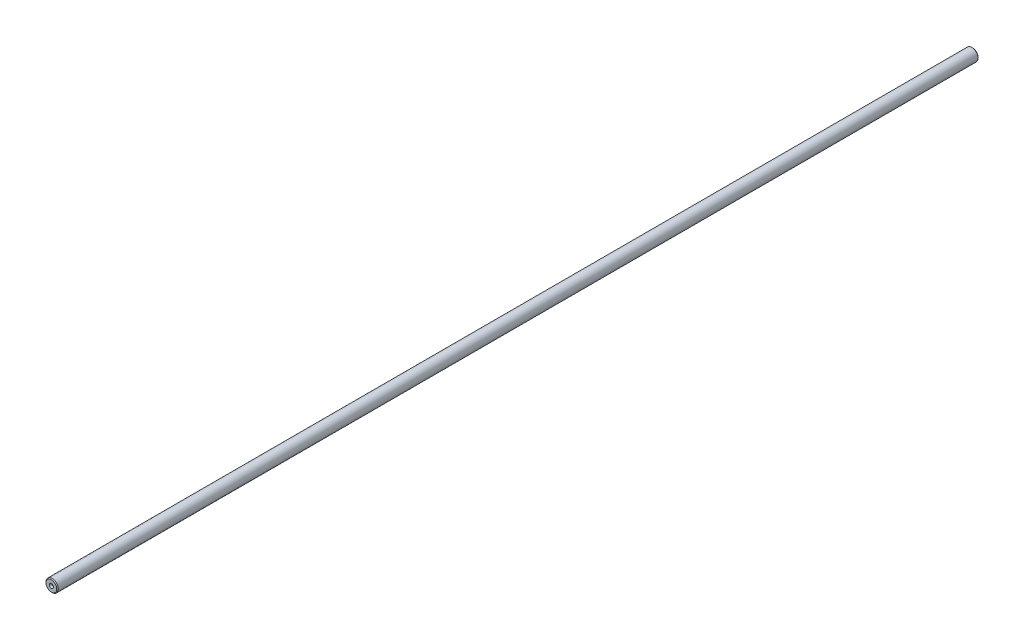
ISO-10303-21;
HEADER;
FILE_DESCRIPTION(('STEP AP214'),'2;1');
FILE_NAME('part.step','',(''),(''),'','','');
FILE_SCHEMA(('AUTOMOTIVE_DESIGN { 1 0 10303 214 1 1 1 1 }'));
ENDSEC;
DATA;
#1=APPLICATION_CONTEXT('core data for automotive mechanical design processes');
#2=APPLICATION_PROTOCOL_DEFINITION('international standard','automotive_design',2000,#1);
#3=PRODUCT_CONTEXT('',#1,'mechanical');
#4=PRODUCT('Part','Part','',(#3));
#5=PRODUCT_RELATED_PRODUCT_CATEGORY('part','',(#4));
#6=PRODUCT_DEFINITION_FORMATION('','',#4);
#7=PRODUCT_DEFINITION_CONTEXT('part definition',#1,'design');
#8=PRODUCT_DEFINITION('design','',#6,#7);
#9=PRODUCT_DEFINITION_SHAPE('','',#8);
#10=(LENGTH_UNIT() NAMED_UNIT(*) SI_UNIT(.MILLI.,.METRE.));
#11=(NAMED_UNIT(*) PLANE_ANGLE_UNIT() SI_UNIT($,.RADIAN.));
#12=(NAMED_UNIT(*) SI_UNIT($,.STERADIAN.) SOLID_ANGLE_UNIT());
#13=UNCERTAINTY_MEASURE_WITH_UNIT(LENGTH_MEASURE(1.E-05),#10,'distance_accuracy_value','');
#14=(GEOMETRIC_REPRESENTATION_CONTEXT(3) GLOBAL_UNCERTAINTY_ASSIGNED_CONTEXT((#13)) GLOBAL_UNIT_ASSIGNED_CONTEXT((#10,
#11,#12)) REPRESENTATION_CONTEXT('',''));
#15=CARTESIAN_POINT('',(0.,0.,0.));
#16=DIRECTION('',(0.,0.,1.));
#17=DIRECTION('',(1.,0.,0.));
#18=AXIS2_PLACEMENT_3D('',#15,#16,#17);
#19=CARTESIAN_POINT('',(0.,0.,600.));
#20=DIRECTION('',(0.,0.,-1.));
#21=DIRECTION('',(-1.,0.,0.));
#22=AXIS2_PLACEMENT_3D('',#19,#20,#21);
#23=CYLINDRICAL_SURFACE('',#22,8.);
#24=CARTESIAN_POINT('',(0.,0.,599.));
#25=DIRECTION('',(0.,0.,1.));
#26=DIRECTION('',(1.,0.,0.));
#27=AXIS2_PLACEMENT_3D('',#24,#25,#26);
#28=CIRCLE('',#27,8.);
#29=CARTESIAN_POINT('',(8.,0.,599.));
#30=VERTEX_POINT('',#29);
#31=EDGE_CURVE('E54',#30,#30,#28,.F.);
#32=ORIENTED_EDGE('',*,*,#31,.T.);
#33=EDGE_LOOP('',(#32));
#34=FACE_BOUND('',#33,.T.);
#35=CARTESIAN_POINT('',(0.,0.,-599.));
#36=DIRECTION('',(0.,0.,1.));
#37=DIRECTION('',(1.,0.,0.));
#38=AXIS2_PLACEMENT_3D('',#35,#36,#37);
#39=CIRCLE('',#38,8.);
#40=CARTESIAN_POINT('',(8.,0.,-599.));
#41=VERTEX_POINT('',#40);
#42=EDGE_CURVE('E95',#41,#41,#39,.T.);
#43=ORIENTED_EDGE('',*,*,#42,.T.);
#44=EDGE_LOOP('',(#43));
#45=FACE_BOUND('',#44,.T.);
#46=ADVANCED_FACE('F44',(#34,#45),#23,.T.);
#47=CARTESIAN_POINT('',(0.,0.,600.));
#48=DIRECTION('',(0.,0.,1.));
#49=DIRECTION('',(1.,0.,0.));
#50=AXIS2_PLACEMENT_3D('',#47,#48,#49);
#51=PLANE('',#50);
#52=CARTESIAN_POINT('',(0.,0.,600.));
#53=DIRECTION('',(0.,0.,1.));
#54=DIRECTION('',(1.,0.,0.));
#55=AXIS2_PLACEMENT_3D('',#52,#53,#54);
#56=CIRCLE('',#55,7.00000000000023);
#57=CARTESIAN_POINT('',(7.00000000000023,0.,600.));
#58=VERTEX_POINT('',#57);
#59=EDGE_CURVE('E91',#58,#58,#56,.T.);
#60=ORIENTED_EDGE('',*,*,#59,.T.);
#61=EDGE_LOOP('',(#60));
#62=FACE_BOUND('',#61,.T.);
#63=CARTESIAN_POINT('',(0.,0.,600.));
#64=DIRECTION('',(0.,0.,1.));
#65=DIRECTION('',(1.,0.,0.));
#66=AXIS2_PLACEMENT_3D('',#63,#64,#65);
#67=CIRCLE('',#66,2.75);
#68=CARTESIAN_POINT('',(2.75,0.,600.));
#69=VERTEX_POINT('',#68);
#70=EDGE_CURVE('E80',#69,#69,#67,.T.);
#71=ORIENTED_EDGE('',*,*,#70,.F.);
#72=EDGE_LOOP('',(#71));
#73=FACE_BOUND('',#72,.T.);
#74=ADVANCED_FACE('F110',(#62,#73),#51,.T.);
#75=CARTESIAN_POINT('',(0.,0.,-600.));
#76=DIRECTION('',(0.,0.,1.));
#77=DIRECTION('',(1.,0.,0.));
#78=AXIS2_PLACEMENT_3D('',#75,#76,#77);
#79=PLANE('',#78);
#80=CARTESIAN_POINT('',(0.,0.,-600.));
#81=DIRECTION('',(0.,0.,1.));
#82=DIRECTION('',(1.,0.,0.));
#83=AXIS2_PLACEMENT_3D('',#80,#81,#82);
#84=CIRCLE('',#83,7.00000000000012);
#85=CARTESIAN_POINT('',(7.00000000000012,0.,-600.));
#86=VERTEX_POINT('',#85);
#87=EDGE_CURVE('E11',#86,#86,#84,.F.);
#88=ORIENTED_EDGE('',*,*,#87,.T.);
#89=EDGE_LOOP('',(#88));
#90=FACE_BOUND('',#89,.T.);
#91=CARTESIAN_POINT('',(0.,0.,-600.));
#92=DIRECTION('',(0.,0.,-1.));
#93=DIRECTION('',(-1.,0.,0.));
#94=AXIS2_PLACEMENT_3D('',#91,#92,#93);
#95=CIRCLE('',#94,2.75);
#96=CARTESIAN_POINT('',(-2.75,0.,-600.));
#97=VERTEX_POINT('',#96);
#98=EDGE_CURVE('E71',#97,#97,#95,.T.);
#99=ORIENTED_EDGE('',*,*,#98,.F.);
#100=EDGE_LOOP('',(#99));
#101=FACE_BOUND('',#100,.T.);
#102=ADVANCED_FACE('F113',(#90,#101),#79,.F.);
#103=CARTESIAN_POINT('',(0.,0.,-595.87124789759));
#104=DIRECTION('',(0.,0.,-1.));
#105=DIRECTION('',(-1.,0.,0.));
#106=AXIS2_PLACEMENT_3D('',#103,#104,#105);
#107=CONICAL_SURFACE('',#106,1.45,1.02974425867665);
#108=CARTESIAN_POINT('',(0.,0.,-595.));
#109=VERTEX_POINT('',#108);
#110=VERTEX_LOOP('',#109);
#111=FACE_BOUND('',#110,.T.);
#112=CARTESIAN_POINT('',(0.,0.,-595.87124789759));
#113=DIRECTION('',(0.,0.,-1.));
#114=DIRECTION('',(-1.,0.,0.));
#115=AXIS2_PLACEMENT_3D('',#112,#113,#114);
#116=CIRCLE('',#115,1.45);
#117=CARTESIAN_POINT('',(-1.45,0.,-595.87124789759));
#118=VERTEX_POINT('',#117);
#119=EDGE_CURVE('E87',#118,#118,#116,.T.);
#120=ORIENTED_EDGE('',*,*,#119,.T.);
#121=EDGE_LOOP('',(#120));
#122=FACE_BOUND('',#121,.T.);
#123=ADVANCED_FACE('F138',(#111,#122),#107,.F.);
#124=CARTESIAN_POINT('',(0.,0.,-600.));
#125=DIRECTION('',(0.,0.,-1.));
#126=DIRECTION('',(-1.,0.,0.));
#127=AXIS2_PLACEMENT_3D('',#124,#125,#126);
#128=CYLINDRICAL_SURFACE('',#127,1.45);
#129=ORIENTED_EDGE('',*,*,#119,.F.);
#130=EDGE_LOOP('',(#129));
#131=FACE_BOUND('',#130,.T.);
#132=CARTESIAN_POINT('',(0.,0.,-597.74833395016));
#133=DIRECTION('',(0.,0.,-1.));
#134=DIRECTION('',(-1.,0.,0.));
#135=AXIS2_PLACEMENT_3D('',#132,#133,#134);
#136=CIRCLE('',#135,1.45);
#137=CARTESIAN_POINT('',(-1.45,0.,-597.74833395016));
#138=VERTEX_POINT('',#137);
#139=EDGE_CURVE('E77',#138,#138,#136,.T.);
#140=ORIENTED_EDGE('',*,*,#139,.T.);
#141=EDGE_LOOP('',(#140));
#142=FACE_BOUND('',#141,.T.);
#143=ADVANCED_FACE('F143',(#131,#142),#128,.F.);
#144=CARTESIAN_POINT('',(0.,0.,-600.));
#145=DIRECTION('',(0.,0.,-1.));
#146=DIRECTION('',(-1.,0.,0.));
#147=AXIS2_PLACEMENT_3D('',#144,#145,#146);
#148=CONICAL_SURFACE('',#147,2.75,0.523598775598306);
#149=ORIENTED_EDGE('',*,*,#139,.F.);
#150=EDGE_LOOP('',(#149));
#151=FACE_BOUND('',#150,.T.);
#152=ORIENTED_EDGE('',*,*,#98,.T.);
#153=EDGE_LOOP('',(#152));
#154=FACE_BOUND('',#153,.T.);
#155=ADVANCED_FACE('F64',(#151,#154),#148,.F.);
#156=CARTESIAN_POINT('',(0.,0.,595.87124789759));
#157=DIRECTION('',(0.,0.,1.));
#158=DIRECTION('',(1.,0.,0.));
#159=AXIS2_PLACEMENT_3D('',#156,#157,#158);
#160=CONICAL_SURFACE('',#159,1.45,1.02974425867665);
#161=CARTESIAN_POINT('',(0.,0.,595.));
#162=VERTEX_POINT('',#161);
#163=VERTEX_LOOP('',#162);
#164=FACE_BOUND('',#163,.T.);
#165=CARTESIAN_POINT('',(0.,0.,595.87124789759));
#166=DIRECTION('',(0.,0.,1.));
#167=DIRECTION('',(1.,0.,0.));
#168=AXIS2_PLACEMENT_3D('',#165,#166,#167);
#169=CIRCLE('',#168,1.45);
#170=CARTESIAN_POINT('',(1.45,0.,595.87124789759));
#171=VERTEX_POINT('',#170);
#172=EDGE_CURVE('E68',#171,#171,#169,.T.);
#173=ORIENTED_EDGE('',*,*,#172,.T.);
#174=EDGE_LOOP('',(#173));
#175=FACE_BOUND('',#174,.T.);
#176=ADVANCED_FACE('F60',(#164,#175),#160,.F.);
#177=CARTESIAN_POINT('',(0.,0.,600.));
#178=DIRECTION('',(0.,0.,1.));
#179=DIRECTION('',(1.,0.,0.));
#180=AXIS2_PLACEMENT_3D('',#177,#178,#179);
#181=CYLINDRICAL_SURFACE('',#180,1.45);
#182=ORIENTED_EDGE('',*,*,#172,.F.);
#183=EDGE_LOOP('',(#182));
#184=FACE_BOUND('',#183,.T.);
#185=CARTESIAN_POINT('',(0.,0.,597.74833395016));
#186=DIRECTION('',(0.,0.,1.));
#187=DIRECTION('',(1.,0.,0.));
#188=AXIS2_PLACEMENT_3D('',#185,#186,#187);
#189=CIRCLE('',#188,1.45);
#190=CARTESIAN_POINT('',(1.45,0.,597.74833395016));
#191=VERTEX_POINT('',#190);
#192=EDGE_CURVE('E72',#191,#191,#189,.T.);
#193=ORIENTED_EDGE('',*,*,#192,.T.);
#194=EDGE_LOOP('',(#193));
#195=FACE_BOUND('',#194,.T.);
#196=ADVANCED_FACE('F63',(#184,#195),#181,.F.);
#197=CARTESIAN_POINT('',(0.,0.,600.));
#198=DIRECTION('',(0.,0.,1.));
#199=DIRECTION('',(1.,0.,0.));
#200=AXIS2_PLACEMENT_3D('',#197,#198,#199);
#201=CONICAL_SURFACE('',#200,2.75,0.523598775598306);
#202=ORIENTED_EDGE('',*,*,#192,.F.);
#203=EDGE_LOOP('',(#202));
#204=FACE_BOUND('',#203,.T.);
#205=ORIENTED_EDGE('',*,*,#70,.T.);
#206=EDGE_LOOP('',(#205));
#207=FACE_BOUND('',#206,.T.);
#208=ADVANCED_FACE('F107',(#204,#207),#201,.F.);
#209=CARTESIAN_POINT('',(0.,0.,600.));
#210=DIRECTION('',(0.,0.,-1.));
#211=DIRECTION('',(-1.,0.,0.));
#212=AXIS2_PLACEMENT_3D('',#209,#210,#211);
#213=CONICAL_SURFACE('',#212,7.00000000000023,0.7853981633975);
#214=ORIENTED_EDGE('',*,*,#31,.F.);
#215=EDGE_LOOP('',(#214));
#216=FACE_BOUND('',#215,.T.);
#217=ORIENTED_EDGE('',*,*,#59,.F.);
#218=EDGE_LOOP('',(#217));
#219=FACE_BOUND('',#218,.T.);
#220=ADVANCED_FACE('F104',(#216,#219),#213,.T.);
#221=CARTESIAN_POINT('',(0.,0.,-599.));
#222=DIRECTION('',(0.,0.,1.));
#223=DIRECTION('',(1.,0.,0.));
#224=AXIS2_PLACEMENT_3D('',#221,#222,#223);
#225=CONICAL_SURFACE('',#224,8.,0.785398163397445);
#226=ORIENTED_EDGE('',*,*,#87,.F.);
#227=EDGE_LOOP('',(#226));
#228=FACE_BOUND('',#227,.T.);
#229=ORIENTED_EDGE('',*,*,#42,.F.);
#230=EDGE_LOOP('',(#229));
#231=FACE_BOUND('',#230,.T.);
#232=ADVANCED_FACE('F47',(#228,#231),#225,.T.);
#233=CLOSED_SHELL('',(#46,#74,#102,#123,#143,#155,#176,#196,#208,#220,#232));
#234=MANIFOLD_SOLID_BREP('B2',#233);
#235=ADVANCED_BREP_SHAPE_REPRESENTATION('',(#18,#234),#14);
#236=SHAPE_DEFINITION_REPRESENTATION(#9,#235);
ENDSEC;
END-ISO-10303-21;
